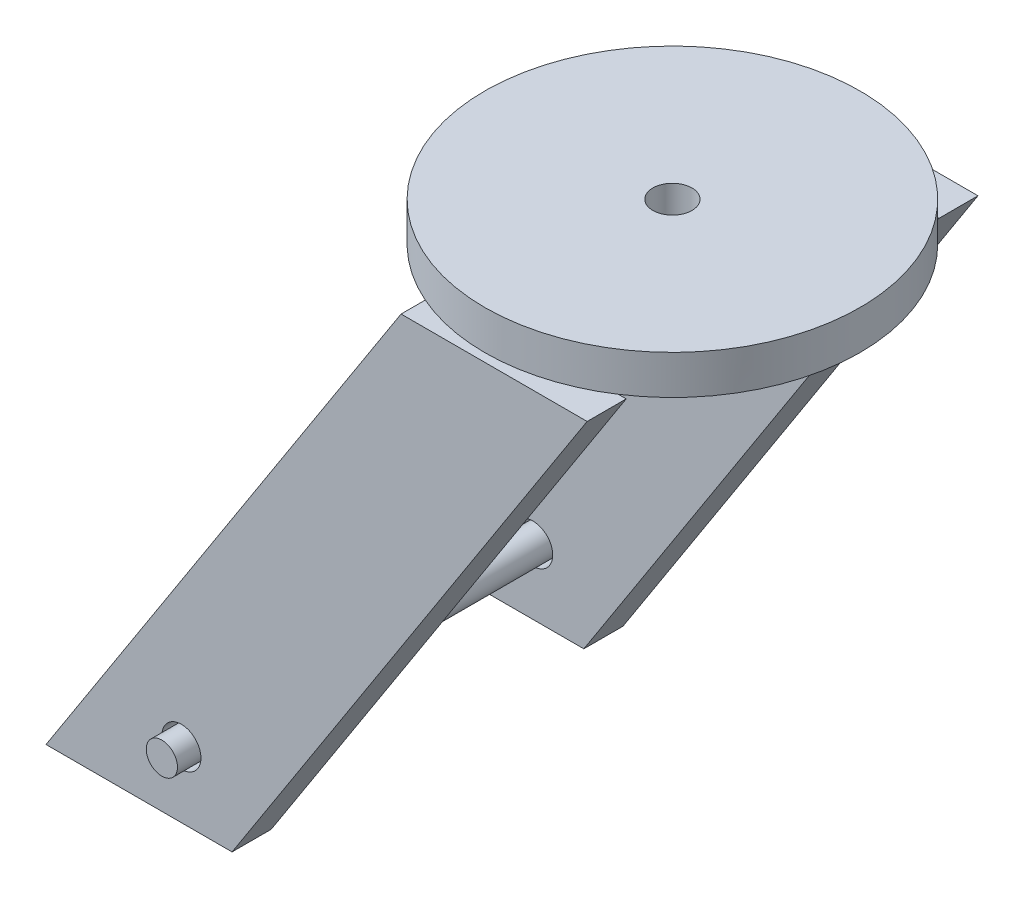
ISO-10303-21;
HEADER;
FILE_DESCRIPTION(('STEP AP214'),'2;1');
FILE_NAME('part.step','',(''),(''),'','','');
FILE_SCHEMA(('AUTOMOTIVE_DESIGN { 1 0 10303 214 1 1 1 1 }'));
ENDSEC;
DATA;
#1=APPLICATION_CONTEXT('core data for automotive mechanical design processes');
#2=APPLICATION_PROTOCOL_DEFINITION('international standard','automotive_design',2000,#1);
#3=PRODUCT_CONTEXT('',#1,'mechanical');
#4=PRODUCT('Part','Part','',(#3));
#5=PRODUCT_RELATED_PRODUCT_CATEGORY('part','',(#4));
#6=PRODUCT_DEFINITION_FORMATION('','',#4);
#7=PRODUCT_DEFINITION_CONTEXT('part definition',#1,'design');
#8=PRODUCT_DEFINITION('design','',#6,#7);
#9=PRODUCT_DEFINITION_SHAPE('','',#8);
#10=(LENGTH_UNIT() NAMED_UNIT(*) SI_UNIT(.MILLI.,.METRE.));
#11=(NAMED_UNIT(*) PLANE_ANGLE_UNIT() SI_UNIT($,.RADIAN.));
#12=(NAMED_UNIT(*) SI_UNIT($,.STERADIAN.) SOLID_ANGLE_UNIT());
#13=UNCERTAINTY_MEASURE_WITH_UNIT(LENGTH_MEASURE(1.E-05),#10,'distance_accuracy_value','');
#14=(GEOMETRIC_REPRESENTATION_CONTEXT(3) GLOBAL_UNCERTAINTY_ASSIGNED_CONTEXT((#13)) GLOBAL_UNIT_ASSIGNED_CONTEXT((#10,
#11,#12)) REPRESENTATION_CONTEXT('',''));
#15=CARTESIAN_POINT('',(0.,0.,0.));
#16=DIRECTION('',(0.,0.,1.));
#17=DIRECTION('',(1.,0.,0.));
#18=AXIS2_PLACEMENT_3D('',#15,#16,#17);
#19=CARTESIAN_POINT('',(34.643655777986,16.8059329644849,-55.));
#20=DIRECTION('',(0.,0.,1.));
#21=DIRECTION('',(1.,0.,0.));
#22=AXIS2_PLACEMENT_3D('',#19,#20,#21);
#23=CYLINDRICAL_SURFACE('',#22,4.);
#24=CARTESIAN_POINT('',(34.643655777986,16.8059329644849,-55.));
#25=DIRECTION('',(0.,0.,1.));
#26=DIRECTION('',(1.,0.,0.));
#27=AXIS2_PLACEMENT_3D('',#24,#25,#26);
#28=CIRCLE('',#27,4.);
#29=CARTESIAN_POINT('',(38.643655777986,16.8059329644849,-55.));
#30=VERTEX_POINT('',#29);
#31=EDGE_CURVE('E11',#30,#30,#28,.T.);
#32=ORIENTED_EDGE('',*,*,#31,.T.);
#33=EDGE_LOOP('',(#32));
#34=FACE_BOUND('',#33,.T.);
#35=CARTESIAN_POINT('',(34.643655777986,16.8059329644849,55.));
#36=DIRECTION('',(0.,0.,1.));
#37=DIRECTION('',(1.,0.,0.));
#38=AXIS2_PLACEMENT_3D('',#35,#36,#37);
#39=CIRCLE('',#38,4.);
#40=CARTESIAN_POINT('',(38.643655777986,16.8059329644849,55.));
#41=VERTEX_POINT('',#40);
#42=EDGE_CURVE('E57',#41,#41,#39,.T.);
#43=ORIENTED_EDGE('',*,*,#42,.F.);
#44=EDGE_LOOP('',(#43));
#45=FACE_BOUND('',#44,.T.);
#46=ADVANCED_FACE('F50',(#34,#45),#23,.T.);
#47=CARTESIAN_POINT('',(34.643655777986,16.8059329644849,-55.));
#48=DIRECTION('',(0.,0.,1.));
#49=DIRECTION('',(1.,0.,0.));
#50=AXIS2_PLACEMENT_3D('',#47,#48,#49);
#51=PLANE('',#50);
#52=ORIENTED_EDGE('',*,*,#31,.F.);
#53=EDGE_LOOP('',(#52));
#54=FACE_BOUND('',#53,.T.);
#55=ADVANCED_FACE('F69',(#54),#51,.F.);
#56=CARTESIAN_POINT('',(34.643655777986,16.8059329644849,55.));
#57=DIRECTION('',(0.,0.,1.));
#58=DIRECTION('',(1.,0.,0.));
#59=AXIS2_PLACEMENT_3D('',#56,#57,#58);
#60=PLANE('',#59);
#61=ORIENTED_EDGE('',*,*,#42,.T.);
#62=EDGE_LOOP('',(#61));
#63=FACE_BOUND('',#62,.T.);
#64=ADVANCED_FACE('F66',(#63),#60,.T.);
#65=CLOSED_SHELL('',(#46,#55,#64));
#66=MANIFOLD_SOLID_BREP('B2',#65);
#67=CARTESIAN_POINT('',(0.,0.,50.));
#68=DIRECTION('',(0.,0.,-1.));
#69=DIRECTION('',(-1.,0.,0.));
#70=AXIS2_PLACEMENT_3D('',#67,#68,#69);
#71=PLANE('',#70);
#72=DIRECTION('',(1.,0.,0.));
#73=VECTOR('',#72,1.);
#74=CARTESIAN_POINT('',(47.6022367630883,0.,50.));
#75=LINE('',#74,#73);
#76=CARTESIAN_POINT('',(0.,0.,50.));
#77=VERTEX_POINT('',#76);
#78=CARTESIAN_POINT('',(47.6022367630883,0.,50.));
#79=VERTEX_POINT('',#78);
#80=EDGE_CURVE('E271',#77,#79,#75,.T.);
#81=ORIENTED_EDGE('',*,*,#80,.T.);
#82=DIRECTION('',(0.542126869822093,0.840296648224244,0.));
#83=VECTOR('',#82,1.);
#84=CARTESIAN_POINT('',(138.44477415953,140.805932964485,50.));
#85=LINE('',#84,#83);
#86=CARTESIAN_POINT('',(138.44477415953,140.805932964485,50.));
#87=VERTEX_POINT('',#86);
#88=EDGE_CURVE('E275',#79,#87,#85,.T.);
#89=ORIENTED_EDGE('',*,*,#88,.T.);
#90=DIRECTION('',(-1.,0.,0.));
#91=VECTOR('',#90,1.);
#92=CARTESIAN_POINT('',(90.8425373964419,140.805932964485,50.));
#93=LINE('',#92,#91);
#94=CARTESIAN_POINT('',(90.8425373964419,140.805932964485,50.));
#95=VERTEX_POINT('',#94);
#96=EDGE_CURVE('E279',#87,#95,#93,.T.);
#97=ORIENTED_EDGE('',*,*,#96,.T.);
#98=DIRECTION('',(-0.542126869822093,-0.840296648224244,0.));
#99=VECTOR('',#98,1.);
#100=CARTESIAN_POINT('',(0.,0.,50.));
#101=LINE('',#100,#99);
#102=EDGE_CURVE('E282',#95,#77,#101,.T.);
#103=ORIENTED_EDGE('',*,*,#102,.T.);
#104=EDGE_LOOP('',(#81,#89,#97,#103));
#105=FACE_BOUND('',#104,.T.);
#106=CARTESIAN_POINT('',(34.643655777986,16.8059329644849,50.));
#107=DIRECTION('',(0.,0.,1.));
#108=DIRECTION('',(1.,0.,0.));
#109=AXIS2_PLACEMENT_3D('',#106,#107,#108);
#110=CIRCLE('',#109,5.);
#111=CARTESIAN_POINT('',(39.643655777986,16.8059329644849,50.));
#112=VERTEX_POINT('',#111);
#113=EDGE_CURVE('E263',#112,#112,#110,.T.);
#114=ORIENTED_EDGE('',*,*,#113,.F.);
#115=EDGE_LOOP('',(#114));
#116=FACE_BOUND('',#115,.T.);
#117=ADVANCED_FACE('F106',(#105,#116),#71,.F.);
#118=CARTESIAN_POINT('',(0.,0.,40.));
#119=DIRECTION('',(0.,0.,-1.));
#120=DIRECTION('',(-1.,0.,0.));
#121=AXIS2_PLACEMENT_3D('',#118,#119,#120);
#122=PLANE('',#121);
#123=DIRECTION('',(1.,0.,0.));
#124=VECTOR('',#123,1.);
#125=CARTESIAN_POINT('',(47.6022367630883,0.,40.));
#126=LINE('',#125,#124);
#127=CARTESIAN_POINT('',(0.,0.,40.));
#128=VERTEX_POINT('',#127);
#129=CARTESIAN_POINT('',(47.6022367630883,0.,40.));
#130=VERTEX_POINT('',#129);
#131=EDGE_CURVE('E267',#128,#130,#126,.T.);
#132=ORIENTED_EDGE('',*,*,#131,.F.);
#133=DIRECTION('',(-0.542126869822093,-0.840296648224244,0.));
#134=VECTOR('',#133,1.);
#135=CARTESIAN_POINT('',(0.,0.,40.));
#136=LINE('',#135,#134);
#137=CARTESIAN_POINT('',(90.8425373964419,140.805932964485,40.));
#138=VERTEX_POINT('',#137);
#139=EDGE_CURVE('E276',#138,#128,#136,.T.);
#140=ORIENTED_EDGE('',*,*,#139,.F.);
#141=DIRECTION('',(-1.,0.,0.));
#142=VECTOR('',#141,1.);
#143=CARTESIAN_POINT('',(90.8425373964419,140.805932964485,40.));
#144=LINE('',#143,#142);
#145=CARTESIAN_POINT('',(136.430329140431,140.805932964485,40.));
#146=VERTEX_POINT('',#145);
#147=EDGE_CURVE('E292',#146,#138,#144,.T.);
#148=ORIENTED_EDGE('',*,*,#147,.F.);
#149=CARTESIAN_POINT('',(138.44477415953,140.805932964485,40.));
#150=VERTEX_POINT('',#149);
#151=EDGE_CURVE('E293',#150,#146,#144,.T.);
#152=ORIENTED_EDGE('',*,*,#151,.F.);
#153=DIRECTION('',(0.542126869822093,0.840296648224244,0.));
#154=VECTOR('',#153,1.);
#155=CARTESIAN_POINT('',(138.44477415953,140.805932964485,40.));
#156=LINE('',#155,#154);
#157=EDGE_CURVE('E289',#130,#150,#156,.T.);
#158=ORIENTED_EDGE('',*,*,#157,.F.);
#159=EDGE_LOOP('',(#132,#140,#148,#152,#158));
#160=FACE_BOUND('',#159,.T.);
#161=CARTESIAN_POINT('',(34.643655777986,16.8059329644849,40.));
#162=DIRECTION('',(0.,0.,1.));
#163=DIRECTION('',(1.,0.,0.));
#164=AXIS2_PLACEMENT_3D('',#161,#162,#163);
#165=CIRCLE('',#164,5.);
#166=CARTESIAN_POINT('',(39.643655777986,16.8059329644849,40.));
#167=VERTEX_POINT('',#166);
#168=EDGE_CURVE('E259',#167,#167,#165,.T.);
#169=ORIENTED_EDGE('',*,*,#168,.T.);
#170=EDGE_LOOP('',(#169));
#171=FACE_BOUND('',#170,.T.);
#172=ADVANCED_FACE('F325',(#160,#171),#122,.T.);
#173=CARTESIAN_POINT('',(47.6022367630883,0.,50.));
#174=DIRECTION('',(0.,1.,0.));
#175=DIRECTION('',(0.,0.,1.));
#176=AXIS2_PLACEMENT_3D('',#173,#174,#175);
#177=PLANE('',#176);
#178=ORIENTED_EDGE('',*,*,#131,.T.);
#179=DIRECTION('',(0.,0.,-1.));
#180=VECTOR('',#179,1.);
#181=CARTESIAN_POINT('',(47.6022367630883,0.,50.));
#182=LINE('',#181,#180);
#183=EDGE_CURVE('E110',#79,#130,#182,.T.);
#184=ORIENTED_EDGE('',*,*,#183,.F.);
#185=ORIENTED_EDGE('',*,*,#80,.F.);
#186=DIRECTION('',(0.,0.,-1.));
#187=VECTOR('',#186,1.);
#188=CARTESIAN_POINT('',(0.,0.,50.));
#189=LINE('',#188,#187);
#190=EDGE_CURVE('E285',#77,#128,#189,.T.);
#191=ORIENTED_EDGE('',*,*,#190,.T.);
#192=EDGE_LOOP('',(#178,#184,#185,#191));
#193=FACE_BOUND('',#192,.T.);
#194=ADVANCED_FACE('F108',(#193),#177,.F.);
#195=CARTESIAN_POINT('',(138.44477415953,140.805932964485,50.));
#196=DIRECTION('',(-0.840296648224244,0.542126869822093,0.));
#197=DIRECTION('',(-0.542126869822093,-0.840296648224244,0.));
#198=AXIS2_PLACEMENT_3D('',#195,#196,#197);
#199=PLANE('',#198);
#200=ORIENTED_EDGE('',*,*,#157,.T.);
#201=DIRECTION('',(0.,0.,-1.));
#202=VECTOR('',#201,1.);
#203=CARTESIAN_POINT('',(138.44477415953,140.805932964485,50.));
#204=LINE('',#203,#202);
#205=EDGE_CURVE('E305',#87,#150,#204,.T.);
#206=ORIENTED_EDGE('',*,*,#205,.F.);
#207=ORIENTED_EDGE('',*,*,#88,.F.);
#208=ORIENTED_EDGE('',*,*,#183,.T.);
#209=EDGE_LOOP('',(#200,#206,#207,#208));
#210=FACE_BOUND('',#209,.T.);
#211=ADVANCED_FACE('F318',(#210),#199,.F.);
#212=CARTESIAN_POINT('',(90.8425373964419,140.805932964485,50.));
#213=DIRECTION('',(0.,-1.,0.));
#214=DIRECTION('',(0.,0.,-1.));
#215=AXIS2_PLACEMENT_3D('',#212,#213,#214);
#216=PLANE('',#215);
#217=CARTESIAN_POINT('',(110.118373537458,140.805932964485,-0.145746877436206));
#218=DIRECTION('',(0.,1.,0.));
#219=DIRECTION('',(0.,0.,1.));
#220=AXIS2_PLACEMENT_3D('',#217,#218,#219);
#221=CIRCLE('',#220,48.);
#222=CARTESIAN_POINT('',(90.8425373964419,140.805932964485,43.8138043152761));
#223=VERTEX_POINT('',#222);
#224=EDGE_CURVE('E48',#223,#146,#221,.T.);
#225=ORIENTED_EDGE('',*,*,#224,.F.);
#226=DIRECTION('',(0.,0.,-1.));
#227=VECTOR('',#226,1.);
#228=CARTESIAN_POINT('',(90.8425373964419,140.805932964485,50.));
#229=LINE('',#228,#227);
#230=EDGE_CURVE('E302',#95,#223,#229,.T.);
#231=ORIENTED_EDGE('',*,*,#230,.F.);
#232=ORIENTED_EDGE('',*,*,#96,.F.);
#233=ORIENTED_EDGE('',*,*,#205,.T.);
#234=ORIENTED_EDGE('',*,*,#151,.T.);
#235=EDGE_LOOP('',(#225,#231,#232,#233,#234));
#236=FACE_BOUND('',#235,.T.);
#237=ADVANCED_FACE('F329',(#236),#216,.F.);
#238=CARTESIAN_POINT('',(0.,0.,50.));
#239=DIRECTION('',(0.840296648224244,-0.542126869822093,0.));
#240=DIRECTION('',(0.542126869822093,0.840296648224244,0.));
#241=AXIS2_PLACEMENT_3D('',#238,#239,#240);
#242=PLANE('',#241);
#243=ORIENTED_EDGE('',*,*,#139,.T.);
#244=ORIENTED_EDGE('',*,*,#190,.F.);
#245=ORIENTED_EDGE('',*,*,#102,.F.);
#246=ORIENTED_EDGE('',*,*,#230,.T.);
#247=EDGE_CURVE('E301',#223,#138,#229,.T.);
#248=ORIENTED_EDGE('',*,*,#247,.T.);
#249=EDGE_LOOP('',(#243,#244,#245,#246,#248));
#250=FACE_BOUND('',#249,.T.);
#251=ADVANCED_FACE('F335',(#250),#242,.F.);
#252=CARTESIAN_POINT('',(34.643655777986,16.8059329644849,50.));
#253=DIRECTION('',(0.,0.,-1.));
#254=DIRECTION('',(-1.,0.,0.));
#255=AXIS2_PLACEMENT_3D('',#252,#253,#254);
#256=CYLINDRICAL_SURFACE('',#255,5.);
#257=ORIENTED_EDGE('',*,*,#113,.T.);
#258=EDGE_LOOP('',(#257));
#259=FACE_BOUND('',#258,.T.);
#260=ORIENTED_EDGE('',*,*,#168,.F.);
#261=EDGE_LOOP('',(#260));
#262=FACE_BOUND('',#261,.T.);
#263=ADVANCED_FACE('F413',(#259,#262),#256,.F.);
#264=CARTESIAN_POINT('',(110.118373537458,140.805932964485,-0.145746877436206));
#265=DIRECTION('',(0.,1.,0.));
#266=DIRECTION('',(0.,0.,1.));
#267=AXIS2_PLACEMENT_3D('',#264,#265,#266);
#268=PLANE('',#267);
#269=CARTESIAN_POINT('',(110.118373537458,140.805932964485,-0.145746877436206));
#270=DIRECTION('',(0.,1.,0.));
#271=DIRECTION('',(0.,0.,1.));
#272=AXIS2_PLACEMENT_3D('',#269,#270,#271);
#273=CIRCLE('',#272,5.);
#274=CARTESIAN_POINT('',(110.118373537458,140.805932964485,4.8542531225638));
#275=VERTEX_POINT('',#274);
#276=EDGE_CURVE('E200',#275,#275,#273,.T.);
#277=ORIENTED_EDGE('',*,*,#276,.T.);
#278=EDGE_LOOP('',(#277));
#279=FACE_BOUND('',#278,.T.);
#280=DIRECTION('',(0.,0.,1.));
#281=VECTOR('',#280,1.);
#282=CARTESIAN_POINT('',(90.8425373964419,140.805932964485,-50.));
#283=LINE('',#282,#281);
#284=CARTESIAN_POINT('',(90.8425373964419,140.805932964485,-44.1052980701485));
#285=VERTEX_POINT('',#284);
#286=CARTESIAN_POINT('',(90.8425373964419,140.805932964485,-40.));
#287=VERTEX_POINT('',#286);
#288=EDGE_CURVE('E244',#285,#287,#283,.T.);
#289=ORIENTED_EDGE('',*,*,#288,.T.);
#290=DIRECTION('',(-1.,0.,0.));
#291=VECTOR('',#290,1.);
#292=CARTESIAN_POINT('',(90.8425373964419,140.805932964485,-40.));
#293=LINE('',#292,#291);
#294=CARTESIAN_POINT('',(136.86979421081,140.805932964485,-40.));
#295=VERTEX_POINT('',#294);
#296=EDGE_CURVE('E238',#295,#287,#293,.T.);
#297=ORIENTED_EDGE('',*,*,#296,.F.);
#298=EDGE_CURVE('E117',#146,#295,#221,.T.);
#299=ORIENTED_EDGE('',*,*,#298,.F.);
#300=ORIENTED_EDGE('',*,*,#147,.T.);
#301=ORIENTED_EDGE('',*,*,#247,.F.);
#302=EDGE_CURVE('E132',#285,#223,#221,.T.);
#303=ORIENTED_EDGE('',*,*,#302,.F.);
#304=EDGE_LOOP('',(#289,#297,#299,#300,#301,#303));
#305=FACE_BOUND('',#304,.T.);
#306=ADVANCED_FACE('F338',(#279,#305),#268,.F.);
#307=CARTESIAN_POINT('',(110.118373537458,150.805932964485,-0.145746877436206));
#308=DIRECTION('',(0.,1.,0.));
#309=DIRECTION('',(0.,0.,1.));
#310=AXIS2_PLACEMENT_3D('',#307,#308,#309);
#311=PLANE('',#310);
#312=CARTESIAN_POINT('',(110.118373537458,150.805932964485,-0.145746877436206));
#313=DIRECTION('',(0.,1.,0.));
#314=DIRECTION('',(0.,0.,1.));
#315=AXIS2_PLACEMENT_3D('',#312,#313,#314);
#316=CIRCLE('',#315,48.);
#317=CARTESIAN_POINT('',(110.118373537458,150.805932964485,47.8542531225638));
#318=VERTEX_POINT('',#317);
#319=EDGE_CURVE('E256',#318,#318,#316,.T.);
#320=ORIENTED_EDGE('',*,*,#319,.T.);
#321=EDGE_LOOP('',(#320));
#322=FACE_BOUND('',#321,.T.);
#323=CARTESIAN_POINT('',(110.118373537458,150.805932964485,-0.145746877436206));
#324=DIRECTION('',(0.,1.,0.));
#325=DIRECTION('',(0.,0.,1.));
#326=AXIS2_PLACEMENT_3D('',#323,#324,#325);
#327=CIRCLE('',#326,5.);
#328=CARTESIAN_POINT('',(110.118373537458,150.805932964485,4.8542531225638));
#329=VERTEX_POINT('',#328);
#330=EDGE_CURVE('E249',#329,#329,#327,.T.);
#331=ORIENTED_EDGE('',*,*,#330,.F.);
#332=EDGE_LOOP('',(#331));
#333=FACE_BOUND('',#332,.T.);
#334=ADVANCED_FACE('F476',(#322,#333),#311,.T.);
#335=CARTESIAN_POINT('',(110.118373537458,150.805932964485,-0.145746877436206));
#336=DIRECTION('',(0.,-1.,0.));
#337=DIRECTION('',(0.,0.,-1.));
#338=AXIS2_PLACEMENT_3D('',#335,#336,#337);
#339=CYLINDRICAL_SURFACE('',#338,48.);
#340=ORIENTED_EDGE('',*,*,#319,.F.);
#341=EDGE_LOOP('',(#340));
#342=FACE_BOUND('',#341,.T.);
#343=ORIENTED_EDGE('',*,*,#298,.T.);
#344=EDGE_CURVE('E118',#295,#285,#221,.T.);
#345=ORIENTED_EDGE('',*,*,#344,.T.);
#346=ORIENTED_EDGE('',*,*,#302,.T.);
#347=ORIENTED_EDGE('',*,*,#224,.T.);
#348=EDGE_LOOP('',(#343,#345,#346,#347));
#349=FACE_BOUND('',#348,.T.);
#350=ADVANCED_FACE('F486',(#342,#349),#339,.T.);
#351=CARTESIAN_POINT('',(110.118373537458,150.805932964485,-0.145746877436206));
#352=DIRECTION('',(0.,-1.,0.));
#353=DIRECTION('',(0.,0.,-1.));
#354=AXIS2_PLACEMENT_3D('',#351,#352,#353);
#355=CYLINDRICAL_SURFACE('',#354,5.);
#356=ORIENTED_EDGE('',*,*,#330,.T.);
#357=EDGE_LOOP('',(#356));
#358=FACE_BOUND('',#357,.T.);
#359=ORIENTED_EDGE('',*,*,#276,.F.);
#360=EDGE_LOOP('',(#359));
#361=FACE_BOUND('',#360,.T.);
#362=ADVANCED_FACE('F401',(#358,#361),#355,.F.);
#363=CARTESIAN_POINT('',(0.,0.,-50.));
#364=DIRECTION('',(0.,0.,1.));
#365=DIRECTION('',(-1.,0.,0.));
#366=AXIS2_PLACEMENT_3D('',#363,#364,#365);
#367=PLANE('',#366);
#368=DIRECTION('',(1.,0.,0.));
#369=VECTOR('',#368,1.);
#370=CARTESIAN_POINT('',(47.6022367630883,0.,-50.));
#371=LINE('',#370,#369);
#372=CARTESIAN_POINT('',(0.,0.,-50.));
#373=VERTEX_POINT('',#372);
#374=CARTESIAN_POINT('',(47.6022367630883,0.,-50.));
#375=VERTEX_POINT('',#374);
#376=EDGE_CURVE('E208',#373,#375,#371,.T.);
#377=ORIENTED_EDGE('',*,*,#376,.F.);
#378=DIRECTION('',(-0.542126869822093,-0.840296648224244,0.));
#379=VECTOR('',#378,1.);
#380=CARTESIAN_POINT('',(0.,0.,-50.));
#381=LINE('',#380,#379);
#382=CARTESIAN_POINT('',(90.8425373964419,140.805932964485,-50.));
#383=VERTEX_POINT('',#382);
#384=EDGE_CURVE('E229',#383,#373,#381,.T.);
#385=ORIENTED_EDGE('',*,*,#384,.F.);
#386=DIRECTION('',(-1.,0.,0.));
#387=VECTOR('',#386,1.);
#388=CARTESIAN_POINT('',(90.8425373964419,140.805932964485,-50.));
#389=LINE('',#388,#387);
#390=CARTESIAN_POINT('',(138.44477415953,140.805932964485,-50.));
#391=VERTEX_POINT('',#390);
#392=EDGE_CURVE('E209',#391,#383,#389,.T.);
#393=ORIENTED_EDGE('',*,*,#392,.F.);
#394=DIRECTION('',(0.542126869822093,0.840296648224244,0.));
#395=VECTOR('',#394,1.);
#396=CARTESIAN_POINT('',(138.44477415953,140.805932964485,-50.));
#397=LINE('',#396,#395);
#398=EDGE_CURVE('E191',#375,#391,#397,.T.);
#399=ORIENTED_EDGE('',*,*,#398,.F.);
#400=EDGE_LOOP('',(#377,#385,#393,#399));
#401=FACE_BOUND('',#400,.T.);
#402=CARTESIAN_POINT('',(34.643655777986,16.8059329644849,-50.));
#403=DIRECTION('',(0.,0.,1.));
#404=DIRECTION('',(1.,0.,0.));
#405=AXIS2_PLACEMENT_3D('',#402,#403,#404);
#406=CIRCLE('',#405,5.);
#407=CARTESIAN_POINT('',(39.643655777986,16.8059329644849,-50.));
#408=VERTEX_POINT('',#407);
#409=EDGE_CURVE('E235',#408,#408,#406,.T.);
#410=ORIENTED_EDGE('',*,*,#409,.T.);
#411=EDGE_LOOP('',(#410));
#412=FACE_BOUND('',#411,.T.);
#413=ADVANCED_FACE('F205',(#401,#412),#367,.F.);
#414=CARTESIAN_POINT('',(0.,0.,-40.));
#415=DIRECTION('',(0.,0.,1.));
#416=DIRECTION('',(-1.,0.,0.));
#417=AXIS2_PLACEMENT_3D('',#414,#415,#416);
#418=PLANE('',#417);
#419=DIRECTION('',(1.,0.,0.));
#420=VECTOR('',#419,1.);
#421=CARTESIAN_POINT('',(47.6022367630883,0.,-40.));
#422=LINE('',#421,#420);
#423=CARTESIAN_POINT('',(0.,0.,-40.));
#424=VERTEX_POINT('',#423);
#425=CARTESIAN_POINT('',(47.6022367630883,0.,-40.));
#426=VERTEX_POINT('',#425);
#427=EDGE_CURVE('E232',#424,#426,#422,.T.);
#428=ORIENTED_EDGE('',*,*,#427,.T.);
#429=DIRECTION('',(0.542126869822093,0.840296648224244,0.));
#430=VECTOR('',#429,1.);
#431=CARTESIAN_POINT('',(138.44477415953,140.805932964485,-40.));
#432=LINE('',#431,#430);
#433=CARTESIAN_POINT('',(138.44477415953,140.805932964485,-40.));
#434=VERTEX_POINT('',#433);
#435=EDGE_CURVE('E194',#426,#434,#432,.T.);
#436=ORIENTED_EDGE('',*,*,#435,.T.);
#437=EDGE_CURVE('E221',#434,#295,#293,.T.);
#438=ORIENTED_EDGE('',*,*,#437,.T.);
#439=ORIENTED_EDGE('',*,*,#296,.T.);
#440=DIRECTION('',(-0.542126869822093,-0.840296648224244,0.));
#441=VECTOR('',#440,1.);
#442=CARTESIAN_POINT('',(0.,0.,-40.));
#443=LINE('',#442,#441);
#444=EDGE_CURVE('E216',#287,#424,#443,.T.);
#445=ORIENTED_EDGE('',*,*,#444,.T.);
#446=EDGE_LOOP('',(#428,#436,#438,#439,#445));
#447=FACE_BOUND('',#446,.T.);
#448=CARTESIAN_POINT('',(34.643655777986,16.8059329644849,-40.));
#449=DIRECTION('',(0.,0.,1.));
#450=DIRECTION('',(1.,0.,0.));
#451=AXIS2_PLACEMENT_3D('',#448,#449,#450);
#452=CIRCLE('',#451,5.);
#453=CARTESIAN_POINT('',(39.643655777986,16.8059329644849,-40.));
#454=VERTEX_POINT('',#453);
#455=EDGE_CURVE('E224',#454,#454,#452,.T.);
#456=ORIENTED_EDGE('',*,*,#455,.F.);
#457=EDGE_LOOP('',(#456));
#458=FACE_BOUND('',#457,.T.);
#459=ADVANCED_FACE('F377',(#447,#458),#418,.T.);
#460=CARTESIAN_POINT('',(47.6022367630883,0.,-50.));
#461=DIRECTION('',(0.,1.,0.));
#462=DIRECTION('',(0.,0.,-1.));
#463=AXIS2_PLACEMENT_3D('',#460,#461,#462);
#464=PLANE('',#463);
#465=ORIENTED_EDGE('',*,*,#427,.F.);
#466=DIRECTION('',(0.,0.,1.));
#467=VECTOR('',#466,1.);
#468=CARTESIAN_POINT('',(0.,0.,-50.));
#469=LINE('',#468,#467);
#470=EDGE_CURVE('E213',#373,#424,#469,.T.);
#471=ORIENTED_EDGE('',*,*,#470,.F.);
#472=ORIENTED_EDGE('',*,*,#376,.T.);
#473=DIRECTION('',(0.,0.,1.));
#474=VECTOR('',#473,1.);
#475=CARTESIAN_POINT('',(47.6022367630883,0.,-50.));
#476=LINE('',#475,#474);
#477=EDGE_CURVE('E188',#375,#426,#476,.T.);
#478=ORIENTED_EDGE('',*,*,#477,.T.);
#479=EDGE_LOOP('',(#465,#471,#472,#478));
#480=FACE_BOUND('',#479,.T.);
#481=ADVANCED_FACE('F212',(#480),#464,.F.);
#482=CARTESIAN_POINT('',(138.44477415953,140.805932964485,-50.));
#483=DIRECTION('',(-0.840296648224244,0.542126869822093,0.));
#484=DIRECTION('',(-0.542126869822093,-0.840296648224244,0.));
#485=AXIS2_PLACEMENT_3D('',#482,#483,#484);
#486=PLANE('',#485);
#487=ORIENTED_EDGE('',*,*,#435,.F.);
#488=ORIENTED_EDGE('',*,*,#477,.F.);
#489=ORIENTED_EDGE('',*,*,#398,.T.);
#490=DIRECTION('',(0.,0.,1.));
#491=VECTOR('',#490,1.);
#492=CARTESIAN_POINT('',(138.44477415953,140.805932964485,-50.));
#493=LINE('',#492,#491);
#494=EDGE_CURVE('E201',#391,#434,#493,.T.);
#495=ORIENTED_EDGE('',*,*,#494,.T.);
#496=EDGE_LOOP('',(#487,#488,#489,#495));
#497=FACE_BOUND('',#496,.T.);
#498=ADVANCED_FACE('F190',(#497),#486,.F.);
#499=CARTESIAN_POINT('',(90.8425373964419,140.805932964485,-50.));
#500=DIRECTION('',(0.,-1.,0.));
#501=DIRECTION('',(0.,0.,1.));
#502=AXIS2_PLACEMENT_3D('',#499,#500,#501);
#503=PLANE('',#502);
#504=EDGE_CURVE('E125',#383,#285,#283,.T.);
#505=ORIENTED_EDGE('',*,*,#504,.T.);
#506=ORIENTED_EDGE('',*,*,#344,.F.);
#507=ORIENTED_EDGE('',*,*,#437,.F.);
#508=ORIENTED_EDGE('',*,*,#494,.F.);
#509=ORIENTED_EDGE('',*,*,#392,.T.);
#510=EDGE_LOOP('',(#505,#506,#507,#508,#509));
#511=FACE_BOUND('',#510,.T.);
#512=ADVANCED_FACE('F529',(#511),#503,.F.);
#513=CARTESIAN_POINT('',(0.,0.,-50.));
#514=DIRECTION('',(0.840296648224244,-0.542126869822093,0.));
#515=DIRECTION('',(0.542126869822093,0.840296648224244,0.));
#516=AXIS2_PLACEMENT_3D('',#513,#514,#515);
#517=PLANE('',#516);
#518=ORIENTED_EDGE('',*,*,#444,.F.);
#519=ORIENTED_EDGE('',*,*,#288,.F.);
#520=ORIENTED_EDGE('',*,*,#504,.F.);
#521=ORIENTED_EDGE('',*,*,#384,.T.);
#522=ORIENTED_EDGE('',*,*,#470,.T.);
#523=EDGE_LOOP('',(#518,#519,#520,#521,#522));
#524=FACE_BOUND('',#523,.T.);
#525=ADVANCED_FACE('F375',(#524),#517,.F.);
#526=CARTESIAN_POINT('',(34.643655777986,16.8059329644849,-50.));
#527=DIRECTION('',(0.,0.,1.));
#528=DIRECTION('',(-1.,0.,0.));
#529=AXIS2_PLACEMENT_3D('',#526,#527,#528);
#530=CYLINDRICAL_SURFACE('',#529,5.);
#531=ORIENTED_EDGE('',*,*,#409,.F.);
#532=EDGE_LOOP('',(#531));
#533=FACE_BOUND('',#532,.T.);
#534=ORIENTED_EDGE('',*,*,#455,.T.);
#535=EDGE_LOOP('',(#534));
#536=FACE_BOUND('',#535,.T.);
#537=ADVANCED_FACE('F393',(#533,#536),#530,.F.);
#538=CLOSED_SHELL('',(#117,#172,#194,#211,#237,#251,#263,#306,#334,#350,#362,#413,#459,#481,
#498,#512,#525,#537));
#539=MANIFOLD_SOLID_BREP('B6',#538);
#540=ADVANCED_BREP_SHAPE_REPRESENTATION('',(#18,#66,#539),#14);
#541=SHAPE_DEFINITION_REPRESENTATION(#9,#540);
ENDSEC;
END-ISO-10303-21;
